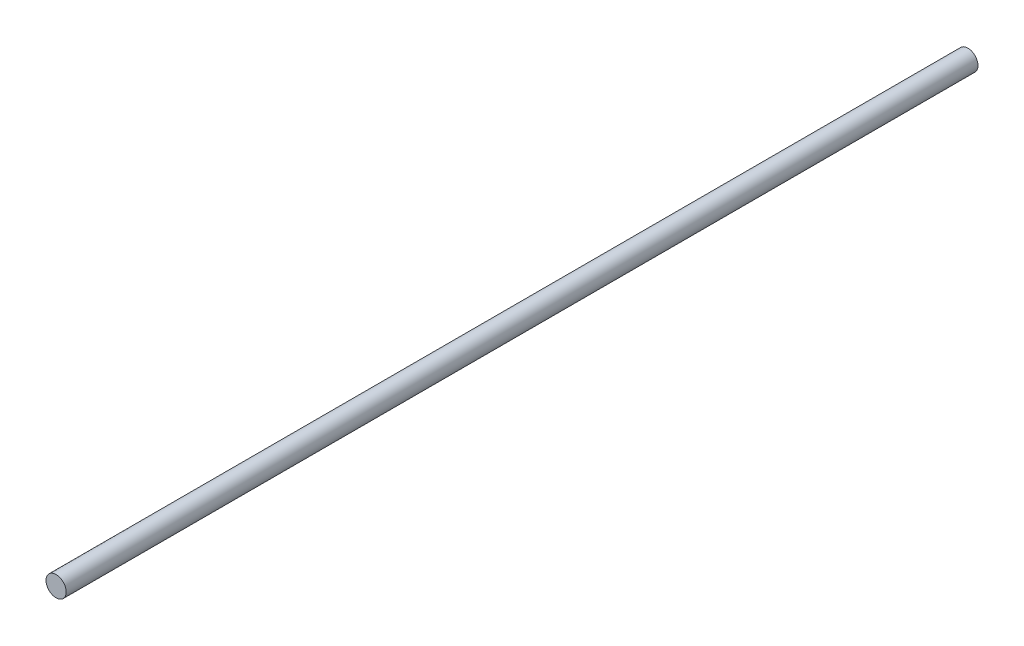
ISO-10303-21;
HEADER;
FILE_DESCRIPTION(('STEP AP214'),'2;1');
FILE_NAME('part.step','',(''),(''),'','','');
FILE_SCHEMA(('AUTOMOTIVE_DESIGN { 1 0 10303 214 1 1 1 1 }'));
ENDSEC;
DATA;
#1=APPLICATION_CONTEXT('core data for automotive mechanical design processes');
#2=APPLICATION_PROTOCOL_DEFINITION('international standard','automotive_design',2000,#1);
#3=PRODUCT_CONTEXT('',#1,'mechanical');
#4=PRODUCT('Part','Part','',(#3));
#5=PRODUCT_RELATED_PRODUCT_CATEGORY('part','',(#4));
#6=PRODUCT_DEFINITION_FORMATION('','',#4);
#7=PRODUCT_DEFINITION_CONTEXT('part definition',#1,'design');
#8=PRODUCT_DEFINITION('design','',#6,#7);
#9=PRODUCT_DEFINITION_SHAPE('','',#8);
#10=(LENGTH_UNIT() NAMED_UNIT(*) SI_UNIT(.MILLI.,.METRE.));
#11=(NAMED_UNIT(*) PLANE_ANGLE_UNIT() SI_UNIT($,.RADIAN.));
#12=(NAMED_UNIT(*) SI_UNIT($,.STERADIAN.) SOLID_ANGLE_UNIT());
#13=UNCERTAINTY_MEASURE_WITH_UNIT(LENGTH_MEASURE(1.E-05),#10,'distance_accuracy_value','');
#14=(GEOMETRIC_REPRESENTATION_CONTEXT(3) GLOBAL_UNCERTAINTY_ASSIGNED_CONTEXT((#13)) GLOBAL_UNIT_ASSIGNED_CONTEXT((#10,
#11,#12)) REPRESENTATION_CONTEXT('',''));
#15=CARTESIAN_POINT('',(0.,0.,0.));
#16=DIRECTION('',(0.,0.,1.));
#17=DIRECTION('',(1.,0.,0.));
#18=AXIS2_PLACEMENT_3D('',#15,#16,#17);
#19=CARTESIAN_POINT('',(0.,0.,300.));
#20=DIRECTION('',(0.,0.,-1.));
#21=DIRECTION('',(-1.,0.,0.));
#22=AXIS2_PLACEMENT_3D('',#19,#20,#21);
#23=CYLINDRICAL_SURFACE('',#22,3.325);
#24=CARTESIAN_POINT('',(0.,0.,300.));
#25=DIRECTION('',(0.,0.,1.));
#26=DIRECTION('',(1.,0.,0.));
#27=AXIS2_PLACEMENT_3D('',#24,#25,#26);
#28=CIRCLE('',#27,3.325);
#29=CARTESIAN_POINT('',(3.325,0.,300.));
#30=VERTEX_POINT('',#29);
#31=EDGE_CURVE('E10',#30,#30,#28,.T.);
#32=ORIENTED_EDGE('',*,*,#31,.F.);
#33=EDGE_LOOP('',(#32));
#34=FACE_BOUND('',#33,.T.);
#35=CARTESIAN_POINT('',(0.,0.,0.));
#36=DIRECTION('',(0.,0.,1.));
#37=DIRECTION('',(1.,0.,0.));
#38=AXIS2_PLACEMENT_3D('',#35,#36,#37);
#39=CIRCLE('',#38,3.325);
#40=CARTESIAN_POINT('',(3.325,0.,0.));
#41=VERTEX_POINT('',#40);
#42=EDGE_CURVE('E36',#41,#41,#39,.T.);
#43=ORIENTED_EDGE('',*,*,#42,.T.);
#44=EDGE_LOOP('',(#43));
#45=FACE_BOUND('',#44,.T.);
#46=ADVANCED_FACE('F33',(#34,#45),#23,.T.);
#47=CARTESIAN_POINT('',(0.,0.,300.));
#48=DIRECTION('',(0.,0.,1.));
#49=DIRECTION('',(1.,0.,0.));
#50=AXIS2_PLACEMENT_3D('',#47,#48,#49);
#51=PLANE('',#50);
#52=ORIENTED_EDGE('',*,*,#31,.T.);
#53=EDGE_LOOP('',(#52));
#54=FACE_BOUND('',#53,.T.);
#55=ADVANCED_FACE('F48',(#54),#51,.T.);
#56=CARTESIAN_POINT('',(0.,0.,0.));
#57=DIRECTION('',(0.,0.,1.));
#58=DIRECTION('',(1.,0.,0.));
#59=AXIS2_PLACEMENT_3D('',#56,#57,#58);
#60=PLANE('',#59);
#61=ORIENTED_EDGE('',*,*,#42,.F.);
#62=EDGE_LOOP('',(#61));
#63=FACE_BOUND('',#62,.T.);
#64=ADVANCED_FACE('F46',(#63),#60,.F.);
#65=CLOSED_SHELL('',(#46,#55,#64));
#66=MANIFOLD_SOLID_BREP('B2',#65);
#67=ADVANCED_BREP_SHAPE_REPRESENTATION('',(#18,#66),#14);
#68=SHAPE_DEFINITION_REPRESENTATION(#9,#67);
ENDSEC;
END-ISO-10303-21;
